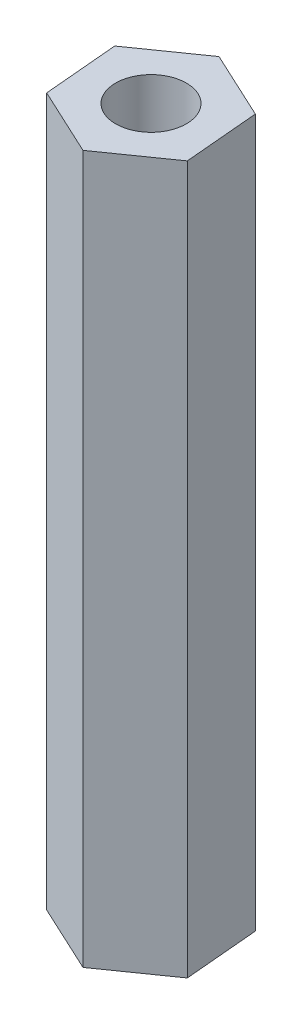
ISO-10303-21;
HEADER;
FILE_DESCRIPTION(('STEP AP214'),'2;1');
FILE_NAME('part.step','',(''),(''),'','','');
FILE_SCHEMA(('AUTOMOTIVE_DESIGN { 1 0 10303 214 1 1 1 1 }'));
ENDSEC;
DATA;
#1=APPLICATION_CONTEXT('core data for automotive mechanical design processes');
#2=APPLICATION_PROTOCOL_DEFINITION('international standard','automotive_design',2000,#1);
#3=PRODUCT_CONTEXT('',#1,'mechanical');
#4=PRODUCT('Part','Part','',(#3));
#5=PRODUCT_RELATED_PRODUCT_CATEGORY('part','',(#4));
#6=PRODUCT_DEFINITION_FORMATION('','',#4);
#7=PRODUCT_DEFINITION_CONTEXT('part definition',#1,'design');
#8=PRODUCT_DEFINITION('design','',#6,#7);
#9=PRODUCT_DEFINITION_SHAPE('','',#8);
#10=(LENGTH_UNIT() NAMED_UNIT(*) SI_UNIT(.MILLI.,.METRE.));
#11=(NAMED_UNIT(*) PLANE_ANGLE_UNIT() SI_UNIT($,.RADIAN.));
#12=(NAMED_UNIT(*) SI_UNIT($,.STERADIAN.) SOLID_ANGLE_UNIT());
#13=UNCERTAINTY_MEASURE_WITH_UNIT(LENGTH_MEASURE(1.E-05),#10,'distance_accuracy_value','');
#14=(GEOMETRIC_REPRESENTATION_CONTEXT(3) GLOBAL_UNCERTAINTY_ASSIGNED_CONTEXT((#13)) GLOBAL_UNIT_ASSIGNED_CONTEXT((#10,
#11,#12)) REPRESENTATION_CONTEXT('',''));
#15=CARTESIAN_POINT('',(0.,0.,0.));
#16=DIRECTION('',(0.,0.,1.));
#17=DIRECTION('',(1.,0.,0.));
#18=AXIS2_PLACEMENT_3D('',#15,#16,#17);
#19=CARTESIAN_POINT('',(0.,30.,0.));
#20=DIRECTION('',(0.,1.,0.));
#21=DIRECTION('',(0.,0.,1.));
#22=AXIS2_PLACEMENT_3D('',#19,#20,#21);
#23=PLANE('',#22);
#24=DIRECTION('',(0.818756747073243,0.,-0.574140565647509));
#25=VECTOR('',#24,1.);
#26=CARTESIAN_POINT('',(0.278935627640859,30.,3.16315163230692));
#27=LINE('',#26,#25);
#28=CARTESIAN_POINT('',(0.278935627640859,30.,3.16315163230692));
#29=VERTEX_POINT('',#28);
#30=CARTESIAN_POINT('',(2.87883748342044,30.,1.34001047659592));
#31=VERTEX_POINT('',#30);
#32=EDGE_CURVE('E131',#29,#31,#27,.T.);
#33=ORIENTED_EDGE('',*,*,#32,.T.);
#34=DIRECTION('',(-0.0878419416572877,0.,-0.996134425309093));
#35=VECTOR('',#34,1.);
#36=CARTESIAN_POINT('',(2.87883748342044,30.,1.34001047659592));
#37=LINE('',#36,#35);
#38=CARTESIAN_POINT('',(2.59990185577958,30.,-1.823141155711));
#39=VERTEX_POINT('',#38);
#40=EDGE_CURVE('E89',#31,#39,#37,.T.);
#41=ORIENTED_EDGE('',*,*,#40,.T.);
#42=DIRECTION('',(-0.906598688730531,0.,-0.421993859661585));
#43=VECTOR('',#42,1.);
#44=CARTESIAN_POINT('',(2.59990185577958,30.,-1.823141155711));
#45=LINE('',#44,#43);
#46=CARTESIAN_POINT('',(-0.278935627640858,30.,-3.16315163230692));
#47=VERTEX_POINT('',#46);
#48=EDGE_CURVE('E102',#39,#47,#45,.T.);
#49=ORIENTED_EDGE('',*,*,#48,.T.);
#50=DIRECTION('',(-0.818756747073243,0.,0.574140565647508));
#51=VECTOR('',#50,1.);
#52=CARTESIAN_POINT('',(-0.278935627640858,30.,-3.16315163230692));
#53=LINE('',#52,#51);
#54=CARTESIAN_POINT('',(-2.87883748342044,30.,-1.34001047659592));
#55=VERTEX_POINT('',#54);
#56=EDGE_CURVE('E96',#47,#55,#53,.T.);
#57=ORIENTED_EDGE('',*,*,#56,.T.);
#58=DIRECTION('',(0.0878419416572878,0.,0.996134425309093));
#59=VECTOR('',#58,1.);
#60=CARTESIAN_POINT('',(-2.87883748342044,30.,-1.34001047659592));
#61=LINE('',#60,#59);
#62=CARTESIAN_POINT('',(-2.59990185577958,30.,1.823141155711));
#63=VERTEX_POINT('',#62);
#64=EDGE_CURVE('E100',#55,#63,#61,.T.);
#65=ORIENTED_EDGE('',*,*,#64,.T.);
#66=DIRECTION('',(0.906598688730531,0.,0.421993859661585));
#67=VECTOR('',#66,1.);
#68=CARTESIAN_POINT('',(-2.59990185577958,30.,1.823141155711));
#69=LINE('',#68,#67);
#70=EDGE_CURVE('E52',#63,#29,#69,.T.);
#71=ORIENTED_EDGE('',*,*,#70,.T.);
#72=EDGE_LOOP('',(#33,#41,#49,#57,#65,#71));
#73=FACE_BOUND('',#72,.T.);
#74=CARTESIAN_POINT('',(0.,30.,0.));
#75=DIRECTION('',(0.,1.,0.));
#76=DIRECTION('',(0.,0.,1.));
#77=AXIS2_PLACEMENT_3D('',#74,#75,#76);
#78=CIRCLE('',#77,1.5);
#79=CARTESIAN_POINT('',(0.,30.,1.5));
#80=VERTEX_POINT('',#79);
#81=EDGE_CURVE('E124',#80,#80,#78,.T.);
#82=ORIENTED_EDGE('',*,*,#81,.F.);
#83=EDGE_LOOP('',(#82));
#84=FACE_BOUND('',#83,.T.);
#85=ADVANCED_FACE('F35',(#73,#84),#23,.T.);
#86=CARTESIAN_POINT('',(0.,0.,0.));
#87=DIRECTION('',(0.,1.,0.));
#88=DIRECTION('',(0.,0.,1.));
#89=AXIS2_PLACEMENT_3D('',#86,#87,#88);
#90=PLANE('',#89);
#91=DIRECTION('',(0.818756747073243,0.,-0.574140565647509));
#92=VECTOR('',#91,1.);
#93=CARTESIAN_POINT('',(0.278935627640859,0.,3.16315163230692));
#94=LINE('',#93,#92);
#95=CARTESIAN_POINT('',(0.278935627640859,0.,3.16315163230692));
#96=VERTEX_POINT('',#95);
#97=CARTESIAN_POINT('',(2.87883748342044,0.,1.34001047659592));
#98=VERTEX_POINT('',#97);
#99=EDGE_CURVE('E120',#96,#98,#94,.T.);
#100=ORIENTED_EDGE('',*,*,#99,.F.);
#101=DIRECTION('',(0.906598688730531,0.,0.421993859661585));
#102=VECTOR('',#101,1.);
#103=CARTESIAN_POINT('',(-2.59990185577958,0.,1.823141155711));
#104=LINE('',#103,#102);
#105=CARTESIAN_POINT('',(-2.59990185577958,0.,1.823141155711));
#106=VERTEX_POINT('',#105);
#107=EDGE_CURVE('E81',#106,#96,#104,.T.);
#108=ORIENTED_EDGE('',*,*,#107,.F.);
#109=DIRECTION('',(0.0878419416572878,0.,0.996134425309093));
#110=VECTOR('',#109,1.);
#111=CARTESIAN_POINT('',(-2.87883748342044,0.,-1.34001047659592));
#112=LINE('',#111,#110);
#113=CARTESIAN_POINT('',(-2.87883748342044,0.,-1.34001047659592));
#114=VERTEX_POINT('',#113);
#115=EDGE_CURVE('E75',#114,#106,#112,.T.);
#116=ORIENTED_EDGE('',*,*,#115,.F.);
#117=DIRECTION('',(-0.818756747073243,0.,0.574140565647508));
#118=VECTOR('',#117,1.);
#119=CARTESIAN_POINT('',(-0.278935627640858,0.,-3.16315163230692));
#120=LINE('',#119,#118);
#121=CARTESIAN_POINT('',(-0.278935627640858,0.,-3.16315163230692));
#122=VERTEX_POINT('',#121);
#123=EDGE_CURVE('E110',#122,#114,#120,.T.);
#124=ORIENTED_EDGE('',*,*,#123,.F.);
#125=DIRECTION('',(-0.906598688730531,0.,-0.421993859661585));
#126=VECTOR('',#125,1.);
#127=CARTESIAN_POINT('',(2.59990185577958,0.,-1.823141155711));
#128=LINE('',#127,#126);
#129=CARTESIAN_POINT('',(2.59990185577958,0.,-1.823141155711));
#130=VERTEX_POINT('',#129);
#131=EDGE_CURVE('E126',#130,#122,#128,.T.);
#132=ORIENTED_EDGE('',*,*,#131,.F.);
#133=DIRECTION('',(-0.0878419416572877,0.,-0.996134425309093));
#134=VECTOR('',#133,1.);
#135=CARTESIAN_POINT('',(2.87883748342044,0.,1.34001047659592));
#136=LINE('',#135,#134);
#137=EDGE_CURVE('E123',#98,#130,#136,.T.);
#138=ORIENTED_EDGE('',*,*,#137,.F.);
#139=EDGE_LOOP('',(#100,#108,#116,#124,#132,#138));
#140=FACE_BOUND('',#139,.T.);
#141=CARTESIAN_POINT('',(0.,0.,0.));
#142=DIRECTION('',(0.,1.,0.));
#143=DIRECTION('',(0.,0.,1.));
#144=AXIS2_PLACEMENT_3D('',#141,#142,#143);
#145=CIRCLE('',#144,1.5);
#146=CARTESIAN_POINT('',(0.,0.,1.5));
#147=VERTEX_POINT('',#146);
#148=EDGE_CURVE('E224',#147,#147,#145,.T.);
#149=ORIENTED_EDGE('',*,*,#148,.T.);
#150=EDGE_LOOP('',(#149));
#151=FACE_BOUND('',#150,.T.);
#152=ADVANCED_FACE('F140',(#140,#151),#90,.F.);
#153=CARTESIAN_POINT('',(0.278935627640859,30.,3.16315163230692));
#154=DIRECTION('',(-0.574140565647509,0.,-0.818756747073243));
#155=DIRECTION('',(-0.818756747073243,0.,0.574140565647509));
#156=AXIS2_PLACEMENT_3D('',#153,#154,#155);
#157=PLANE('',#156);
#158=ORIENTED_EDGE('',*,*,#99,.T.);
#159=DIRECTION('',(0.,-1.,0.));
#160=VECTOR('',#159,1.);
#161=CARTESIAN_POINT('',(2.87883748342044,30.,1.34001047659592));
#162=LINE('',#161,#160);
#163=EDGE_CURVE('E11',#31,#98,#162,.T.);
#164=ORIENTED_EDGE('',*,*,#163,.F.);
#165=ORIENTED_EDGE('',*,*,#32,.F.);
#166=DIRECTION('',(0.,-1.,0.));
#167=VECTOR('',#166,1.);
#168=CARTESIAN_POINT('',(0.278935627640859,30.,3.16315163230692));
#169=LINE('',#168,#167);
#170=EDGE_CURVE('E116',#29,#96,#169,.T.);
#171=ORIENTED_EDGE('',*,*,#170,.T.);
#172=EDGE_LOOP('',(#158,#164,#165,#171));
#173=FACE_BOUND('',#172,.T.);
#174=ADVANCED_FACE('F37',(#173),#157,.F.);
#175=CARTESIAN_POINT('',(2.87883748342044,30.,1.34001047659592));
#176=DIRECTION('',(-0.996134425309093,0.,0.0878419416572877));
#177=DIRECTION('',(0.0878419416572878,0.,0.996134425309093));
#178=AXIS2_PLACEMENT_3D('',#175,#176,#177);
#179=PLANE('',#178);
#180=ORIENTED_EDGE('',*,*,#137,.T.);
#181=DIRECTION('',(0.,-1.,0.));
#182=VECTOR('',#181,1.);
#183=CARTESIAN_POINT('',(2.59990185577958,30.,-1.823141155711));
#184=LINE('',#183,#182);
#185=EDGE_CURVE('E44',#39,#130,#184,.T.);
#186=ORIENTED_EDGE('',*,*,#185,.F.);
#187=ORIENTED_EDGE('',*,*,#40,.F.);
#188=ORIENTED_EDGE('',*,*,#163,.T.);
#189=EDGE_LOOP('',(#180,#186,#187,#188));
#190=FACE_BOUND('',#189,.T.);
#191=ADVANCED_FACE('F165',(#190),#179,.F.);
#192=CARTESIAN_POINT('',(2.59990185577958,30.,-1.823141155711));
#193=DIRECTION('',(-0.421993859661585,0.,0.906598688730531));
#194=DIRECTION('',(0.906598688730531,0.,0.421993859661585));
#195=AXIS2_PLACEMENT_3D('',#192,#193,#194);
#196=PLANE('',#195);
#197=ORIENTED_EDGE('',*,*,#131,.T.);
#198=DIRECTION('',(0.,-1.,0.));
#199=VECTOR('',#198,1.);
#200=CARTESIAN_POINT('',(-0.278935627640858,30.,-3.16315163230692));
#201=LINE('',#200,#199);
#202=EDGE_CURVE('E111',#47,#122,#201,.T.);
#203=ORIENTED_EDGE('',*,*,#202,.F.);
#204=ORIENTED_EDGE('',*,*,#48,.F.);
#205=ORIENTED_EDGE('',*,*,#185,.T.);
#206=EDGE_LOOP('',(#197,#203,#204,#205));
#207=FACE_BOUND('',#206,.T.);
#208=ADVANCED_FACE('F137',(#207),#196,.F.);
#209=CARTESIAN_POINT('',(-0.278935627640858,30.,-3.16315163230692));
#210=DIRECTION('',(0.574140565647508,0.,0.818756747073243));
#211=DIRECTION('',(0.818756747073243,0.,-0.574140565647508));
#212=AXIS2_PLACEMENT_3D('',#209,#210,#211);
#213=PLANE('',#212);
#214=ORIENTED_EDGE('',*,*,#123,.T.);
#215=DIRECTION('',(0.,-1.,0.));
#216=VECTOR('',#215,1.);
#217=CARTESIAN_POINT('',(-2.87883748342044,30.,-1.34001047659592));
#218=LINE('',#217,#216);
#219=EDGE_CURVE('E107',#55,#114,#218,.T.);
#220=ORIENTED_EDGE('',*,*,#219,.F.);
#221=ORIENTED_EDGE('',*,*,#56,.F.);
#222=ORIENTED_EDGE('',*,*,#202,.T.);
#223=EDGE_LOOP('',(#214,#220,#221,#222));
#224=FACE_BOUND('',#223,.T.);
#225=ADVANCED_FACE('F108',(#224),#213,.F.);
#226=CARTESIAN_POINT('',(-2.87883748342044,30.,-1.34001047659592));
#227=DIRECTION('',(0.996134425309093,0.,-0.0878419416572878));
#228=DIRECTION('',(-0.0878419416572878,0.,-0.996134425309093));
#229=AXIS2_PLACEMENT_3D('',#226,#227,#228);
#230=PLANE('',#229);
#231=ORIENTED_EDGE('',*,*,#115,.T.);
#232=DIRECTION('',(0.,-1.,0.));
#233=VECTOR('',#232,1.);
#234=CARTESIAN_POINT('',(-2.59990185577958,30.,1.823141155711));
#235=LINE('',#234,#233);
#236=EDGE_CURVE('E112',#63,#106,#235,.T.);
#237=ORIENTED_EDGE('',*,*,#236,.F.);
#238=ORIENTED_EDGE('',*,*,#64,.F.);
#239=ORIENTED_EDGE('',*,*,#219,.T.);
#240=EDGE_LOOP('',(#231,#237,#238,#239));
#241=FACE_BOUND('',#240,.T.);
#242=ADVANCED_FACE('F114',(#241),#230,.F.);
#243=CARTESIAN_POINT('',(-2.59990185577958,30.,1.823141155711));
#244=DIRECTION('',(0.421993859661585,0.,-0.906598688730531));
#245=DIRECTION('',(-0.906598688730531,0.,-0.421993859661585));
#246=AXIS2_PLACEMENT_3D('',#243,#244,#245);
#247=PLANE('',#246);
#248=ORIENTED_EDGE('',*,*,#107,.T.);
#249=ORIENTED_EDGE('',*,*,#170,.F.);
#250=ORIENTED_EDGE('',*,*,#70,.F.);
#251=ORIENTED_EDGE('',*,*,#236,.T.);
#252=EDGE_LOOP('',(#248,#249,#250,#251));
#253=FACE_BOUND('',#252,.T.);
#254=ADVANCED_FACE('F145',(#253),#247,.F.);
#255=CARTESIAN_POINT('',(0.,30.,0.));
#256=DIRECTION('',(0.,-1.,0.));
#257=DIRECTION('',(0.,0.,-1.));
#258=AXIS2_PLACEMENT_3D('',#255,#256,#257);
#259=CYLINDRICAL_SURFACE('',#258,1.5);
#260=ORIENTED_EDGE('',*,*,#81,.T.);
#261=EDGE_LOOP('',(#260));
#262=FACE_BOUND('',#261,.T.);
#263=ORIENTED_EDGE('',*,*,#148,.F.);
#264=EDGE_LOOP('',(#263));
#265=FACE_BOUND('',#264,.T.);
#266=ADVANCED_FACE('F147',(#262,#265),#259,.F.);
#267=CLOSED_SHELL('',(#85,#152,#174,#191,#208,#225,#242,#254,#266));
#268=MANIFOLD_SOLID_BREP('B2',#267);
#269=ADVANCED_BREP_SHAPE_REPRESENTATION('',(#18,#268),#14);
#270=SHAPE_DEFINITION_REPRESENTATION(#9,#269);
ENDSEC;
END-ISO-10303-21;
